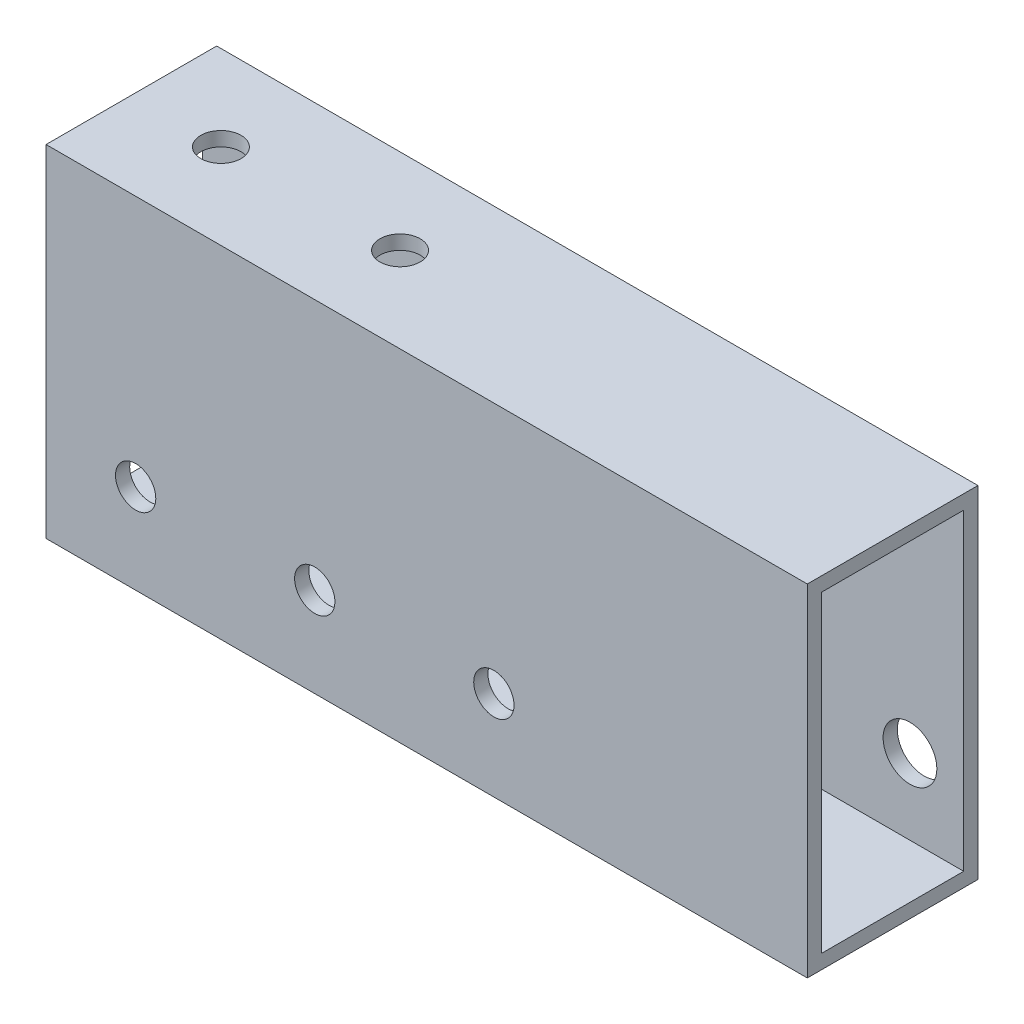
ISO-10303-21;
HEADER;
FILE_DESCRIPTION(('STEP AP214'),'2;1');
FILE_NAME('part.step','',(''),(''),'','','');
FILE_SCHEMA(('AUTOMOTIVE_DESIGN { 1 0 10303 214 1 1 1 1 }'));
ENDSEC;
DATA;
#1=APPLICATION_CONTEXT('core data for automotive mechanical design processes');
#2=APPLICATION_PROTOCOL_DEFINITION('international standard','automotive_design',2000,#1);
#3=PRODUCT_CONTEXT('',#1,'mechanical');
#4=PRODUCT('Part','Part','',(#3));
#5=PRODUCT_RELATED_PRODUCT_CATEGORY('part','',(#4));
#6=PRODUCT_DEFINITION_FORMATION('','',#4);
#7=PRODUCT_DEFINITION_CONTEXT('part definition',#1,'design');
#8=PRODUCT_DEFINITION('design','',#6,#7);
#9=PRODUCT_DEFINITION_SHAPE('','',#8);
#10=(LENGTH_UNIT() NAMED_UNIT(*) SI_UNIT(.MILLI.,.METRE.));
#11=(NAMED_UNIT(*) PLANE_ANGLE_UNIT() SI_UNIT($,.RADIAN.));
#12=(NAMED_UNIT(*) SI_UNIT($,.STERADIAN.) SOLID_ANGLE_UNIT());
#13=UNCERTAINTY_MEASURE_WITH_UNIT(LENGTH_MEASURE(1.E-05),#10,'distance_accuracy_value','');
#14=(GEOMETRIC_REPRESENTATION_CONTEXT(3) GLOBAL_UNCERTAINTY_ASSIGNED_CONTEXT((#13)) GLOBAL_UNIT_ASSIGNED_CONTEXT((#10,
#11,#12)) REPRESENTATION_CONTEXT('',''));
#15=CARTESIAN_POINT('',(0.,0.,0.));
#16=DIRECTION('',(0.,0.,1.));
#17=DIRECTION('',(1.,0.,0.));
#18=AXIS2_PLACEMENT_3D('',#15,#16,#17);
#19=CARTESIAN_POINT('',(-40.,38.1,-19.05));
#20=DIRECTION('',(0.,0.,-1.));
#21=DIRECTION('',(0.,1.,0.));
#22=AXIS2_PLACEMENT_3D('',#19,#20,#21);
#23=PLANE('',#22);
#24=CARTESIAN_POINT('',(118.,-18.1,-19.05));
#25=DIRECTION('',(0.,0.,-1.));
#26=DIRECTION('',(0.,1.,0.));
#27=AXIS2_PLACEMENT_3D('',#24,#25,#26);
#28=CIRCLE('',#27,6.00000000000001);
#29=CARTESIAN_POINT('',(118.,-12.1,-19.05));
#30=VERTEX_POINT('',#29);
#31=EDGE_CURVE('E307',#30,#30,#28,.T.);
#32=ORIENTED_EDGE('',*,*,#31,.F.);
#33=EDGE_LOOP('',(#32));
#34=FACE_BOUND('',#33,.T.);
#35=CARTESIAN_POINT('',(82.,-18.1,-19.05));
#36=DIRECTION('',(0.,0.,-1.));
#37=DIRECTION('',(0.,1.,0.));
#38=AXIS2_PLACEMENT_3D('',#35,#36,#37);
#39=CIRCLE('',#38,6.00000000000001);
#40=CARTESIAN_POINT('',(82.,-12.1,-19.05));
#41=VERTEX_POINT('',#40);
#42=EDGE_CURVE('E311',#41,#41,#39,.T.);
#43=ORIENTED_EDGE('',*,*,#42,.F.);
#44=EDGE_LOOP('',(#43));
#45=FACE_BOUND('',#44,.T.);
#46=CARTESIAN_POINT('',(-20.,-18.1,-19.05));
#47=DIRECTION('',(0.,0.,-1.));
#48=DIRECTION('',(0.,1.,0.));
#49=AXIS2_PLACEMENT_3D('',#46,#47,#48);
#50=CIRCLE('',#49,4.5);
#51=CARTESIAN_POINT('',(-20.,-13.6,-19.05));
#52=VERTEX_POINT('',#51);
#53=EDGE_CURVE('E237',#52,#52,#50,.T.);
#54=ORIENTED_EDGE('',*,*,#53,.F.);
#55=EDGE_LOOP('',(#54));
#56=FACE_BOUND('',#55,.T.);
#57=CARTESIAN_POINT('',(20.,-18.1,-19.05));
#58=DIRECTION('',(0.,0.,-1.));
#59=DIRECTION('',(0.,1.,0.));
#60=AXIS2_PLACEMENT_3D('',#57,#58,#59);
#61=CIRCLE('',#60,4.5);
#62=CARTESIAN_POINT('',(20.,-13.6,-19.05));
#63=VERTEX_POINT('',#62);
#64=EDGE_CURVE('E255',#63,#63,#61,.T.);
#65=ORIENTED_EDGE('',*,*,#64,.F.);
#66=EDGE_LOOP('',(#65));
#67=FACE_BOUND('',#66,.T.);
#68=CARTESIAN_POINT('',(60.,-18.1,-19.05));
#69=DIRECTION('',(0.,0.,-1.));
#70=DIRECTION('',(0.,1.,0.));
#71=AXIS2_PLACEMENT_3D('',#68,#69,#70);
#72=CIRCLE('',#71,4.5);
#73=CARTESIAN_POINT('',(60.,-13.6,-19.05));
#74=VERTEX_POINT('',#73);
#75=EDGE_CURVE('E267',#74,#74,#72,.T.);
#76=ORIENTED_EDGE('',*,*,#75,.F.);
#77=EDGE_LOOP('',(#76));
#78=FACE_BOUND('',#77,.T.);
#79=DIRECTION('',(1.,0.,0.));
#80=VECTOR('',#79,1.);
#81=CARTESIAN_POINT('',(-40.,38.1,-19.05));
#82=LINE('',#81,#80);
#83=CARTESIAN_POINT('',(-40.,38.1,-19.05));
#84=VERTEX_POINT('',#83);
#85=CARTESIAN_POINT('',(130.,38.1,-19.05));
#86=VERTEX_POINT('',#85);
#87=EDGE_CURVE('E217',#84,#86,#82,.T.);
#88=ORIENTED_EDGE('',*,*,#87,.T.);
#89=DIRECTION('',(0.,1.,0.));
#90=VECTOR('',#89,1.);
#91=CARTESIAN_POINT('',(130.,38.1,-19.05));
#92=LINE('',#91,#90);
#93=CARTESIAN_POINT('',(130.,-38.1,-19.05));
#94=VERTEX_POINT('',#93);
#95=EDGE_CURVE('E172',#94,#86,#92,.T.);
#96=ORIENTED_EDGE('',*,*,#95,.F.);
#97=DIRECTION('',(1.,0.,0.));
#98=VECTOR('',#97,1.);
#99=CARTESIAN_POINT('',(-40.,-38.1,-19.05));
#100=LINE('',#99,#98);
#101=CARTESIAN_POINT('',(-40.,-38.1,-19.05));
#102=VERTEX_POINT('',#101);
#103=EDGE_CURVE('E13',#102,#94,#100,.T.);
#104=ORIENTED_EDGE('',*,*,#103,.F.);
#105=DIRECTION('',(0.,1.,0.));
#106=VECTOR('',#105,1.);
#107=CARTESIAN_POINT('',(-40.,38.1,-19.05));
#108=LINE('',#107,#106);
#109=EDGE_CURVE('E204',#102,#84,#108,.T.);
#110=ORIENTED_EDGE('',*,*,#109,.T.);
#111=EDGE_LOOP('',(#88,#96,#104,#110));
#112=FACE_BOUND('',#111,.T.);
#113=ADVANCED_FACE('F86',(#34,#45,#56,#67,#78,#112),#23,.T.);
#114=CARTESIAN_POINT('',(-40.,-38.1,19.05));
#115=DIRECTION('',(0.,-1.,0.));
#116=DIRECTION('',(0.,0.,-1.));
#117=AXIS2_PLACEMENT_3D('',#114,#115,#116);
#118=PLANE('',#117);
#119=CARTESIAN_POINT('',(20.,-38.1,0.));
#120=DIRECTION('',(0.,-1.,0.));
#121=DIRECTION('',(0.,0.,-1.));
#122=AXIS2_PLACEMENT_3D('',#119,#120,#121);
#123=CIRCLE('',#122,4.49999999999999);
#124=CARTESIAN_POINT('',(20.,-38.1,-4.49999999999999));
#125=VERTEX_POINT('',#124);
#126=EDGE_CURVE('E521',#125,#125,#123,.T.);
#127=ORIENTED_EDGE('',*,*,#126,.F.);
#128=EDGE_LOOP('',(#127));
#129=FACE_BOUND('',#128,.T.);
#130=CARTESIAN_POINT('',(-20.,-38.1,0.));
#131=DIRECTION('',(0.,-1.,0.));
#132=DIRECTION('',(0.,0.,-1.));
#133=AXIS2_PLACEMENT_3D('',#130,#131,#132);
#134=CIRCLE('',#133,4.49999999999999);
#135=CARTESIAN_POINT('',(-20.,-38.1,-4.5));
#136=VERTEX_POINT('',#135);
#137=EDGE_CURVE('E240',#136,#136,#134,.T.);
#138=ORIENTED_EDGE('',*,*,#137,.F.);
#139=EDGE_LOOP('',(#138));
#140=FACE_BOUND('',#139,.T.);
#141=ORIENTED_EDGE('',*,*,#103,.T.);
#142=DIRECTION('',(0.,0.,-1.));
#143=VECTOR('',#142,1.);
#144=CARTESIAN_POINT('',(130.,-38.1,19.05));
#145=LINE('',#144,#143);
#146=CARTESIAN_POINT('',(130.,-38.1,19.05));
#147=VERTEX_POINT('',#146);
#148=EDGE_CURVE('E185',#147,#94,#145,.T.);
#149=ORIENTED_EDGE('',*,*,#148,.F.);
#150=DIRECTION('',(1.,0.,0.));
#151=VECTOR('',#150,1.);
#152=CARTESIAN_POINT('',(-40.,-38.1,19.05));
#153=LINE('',#152,#151);
#154=CARTESIAN_POINT('',(-40.,-38.1,19.05));
#155=VERTEX_POINT('',#154);
#156=EDGE_CURVE('E94',#155,#147,#153,.T.);
#157=ORIENTED_EDGE('',*,*,#156,.F.);
#158=DIRECTION('',(0.,0.,-1.));
#159=VECTOR('',#158,1.);
#160=CARTESIAN_POINT('',(-40.,-38.1,19.05));
#161=LINE('',#160,#159);
#162=EDGE_CURVE('E215',#155,#102,#161,.T.);
#163=ORIENTED_EDGE('',*,*,#162,.T.);
#164=EDGE_LOOP('',(#141,#149,#157,#163));
#165=FACE_BOUND('',#164,.T.);
#166=ADVANCED_FACE('F297',(#129,#140,#165),#118,.T.);
#167=CARTESIAN_POINT('',(-40.,38.1,19.05));
#168=DIRECTION('',(0.,0.,1.));
#169=DIRECTION('',(0.,-1.,0.));
#170=AXIS2_PLACEMENT_3D('',#167,#168,#169);
#171=PLANE('',#170);
#172=CARTESIAN_POINT('',(-20.,-18.1,19.05));
#173=DIRECTION('',(0.,0.,-1.));
#174=DIRECTION('',(0.,1.,0.));
#175=AXIS2_PLACEMENT_3D('',#172,#173,#174);
#176=CIRCLE('',#175,4.5);
#177=CARTESIAN_POINT('',(-20.,-13.6,19.05));
#178=VERTEX_POINT('',#177);
#179=EDGE_CURVE('E229',#178,#178,#176,.T.);
#180=ORIENTED_EDGE('',*,*,#179,.T.);
#181=EDGE_LOOP('',(#180));
#182=FACE_BOUND('',#181,.T.);
#183=CARTESIAN_POINT('',(20.,-18.1,19.05));
#184=DIRECTION('',(0.,0.,-1.));
#185=DIRECTION('',(0.,1.,0.));
#186=AXIS2_PLACEMENT_3D('',#183,#184,#185);
#187=CIRCLE('',#186,4.5);
#188=CARTESIAN_POINT('',(20.,-13.6,19.05));
#189=VERTEX_POINT('',#188);
#190=EDGE_CURVE('E258',#189,#189,#187,.T.);
#191=ORIENTED_EDGE('',*,*,#190,.T.);
#192=EDGE_LOOP('',(#191));
#193=FACE_BOUND('',#192,.T.);
#194=CARTESIAN_POINT('',(60.,-18.1,19.05));
#195=DIRECTION('',(0.,0.,-1.));
#196=DIRECTION('',(0.,1.,0.));
#197=AXIS2_PLACEMENT_3D('',#194,#195,#196);
#198=CIRCLE('',#197,4.49999999999999);
#199=CARTESIAN_POINT('',(60.,-13.6,19.05));
#200=VERTEX_POINT('',#199);
#201=EDGE_CURVE('E225',#200,#200,#198,.T.);
#202=ORIENTED_EDGE('',*,*,#201,.T.);
#203=EDGE_LOOP('',(#202));
#204=FACE_BOUND('',#203,.T.);
#205=ORIENTED_EDGE('',*,*,#156,.T.);
#206=DIRECTION('',(0.,-1.,0.));
#207=VECTOR('',#206,1.);
#208=CARTESIAN_POINT('',(130.,38.1,19.05));
#209=LINE('',#208,#207);
#210=CARTESIAN_POINT('',(130.,38.1,19.05));
#211=VERTEX_POINT('',#210);
#212=EDGE_CURVE('E188',#211,#147,#209,.T.);
#213=ORIENTED_EDGE('',*,*,#212,.F.);
#214=DIRECTION('',(1.,0.,0.));
#215=VECTOR('',#214,1.);
#216=CARTESIAN_POINT('',(-40.,38.1,19.05));
#217=LINE('',#216,#215);
#218=CARTESIAN_POINT('',(-40.,38.1,19.05));
#219=VERTEX_POINT('',#218);
#220=EDGE_CURVE('E220',#219,#211,#217,.T.);
#221=ORIENTED_EDGE('',*,*,#220,.F.);
#222=DIRECTION('',(0.,-1.,0.));
#223=VECTOR('',#222,1.);
#224=CARTESIAN_POINT('',(-40.,38.1,19.05));
#225=LINE('',#224,#223);
#226=EDGE_CURVE('E212',#219,#155,#225,.T.);
#227=ORIENTED_EDGE('',*,*,#226,.T.);
#228=EDGE_LOOP('',(#205,#213,#221,#227));
#229=FACE_BOUND('',#228,.T.);
#230=ADVANCED_FACE('F272',(#182,#193,#204,#229),#171,.T.);
#231=CARTESIAN_POINT('',(-40.,38.1,19.05));
#232=DIRECTION('',(0.,1.,0.));
#233=DIRECTION('',(0.,0.,1.));
#234=AXIS2_PLACEMENT_3D('',#231,#232,#233);
#235=PLANE('',#234);
#236=CARTESIAN_POINT('',(20.,38.1,0.));
#237=DIRECTION('',(0.,-1.,0.));
#238=DIRECTION('',(0.,0.,-1.));
#239=AXIS2_PLACEMENT_3D('',#236,#237,#238);
#240=CIRCLE('',#239,4.49999999999999);
#241=CARTESIAN_POINT('',(20.,38.1,-4.49999999999999));
#242=VERTEX_POINT('',#241);
#243=EDGE_CURVE('E524',#242,#242,#240,.T.);
#244=ORIENTED_EDGE('',*,*,#243,.T.);
#245=EDGE_LOOP('',(#244));
#246=FACE_BOUND('',#245,.T.);
#247=CARTESIAN_POINT('',(-20.,38.1,0.));
#248=DIRECTION('',(0.,-1.,0.));
#249=DIRECTION('',(0.,0.,-1.));
#250=AXIS2_PLACEMENT_3D('',#247,#248,#249);
#251=CIRCLE('',#250,4.49999999999999);
#252=CARTESIAN_POINT('',(-20.,38.1,-4.49999999999999));
#253=VERTEX_POINT('',#252);
#254=EDGE_CURVE('E233',#253,#253,#251,.T.);
#255=ORIENTED_EDGE('',*,*,#254,.T.);
#256=EDGE_LOOP('',(#255));
#257=FACE_BOUND('',#256,.T.);
#258=ORIENTED_EDGE('',*,*,#220,.T.);
#259=DIRECTION('',(0.,0.,1.));
#260=VECTOR('',#259,1.);
#261=CARTESIAN_POINT('',(130.,38.1,19.05));
#262=LINE('',#261,#260);
#263=EDGE_CURVE('E191',#86,#211,#262,.T.);
#264=ORIENTED_EDGE('',*,*,#263,.F.);
#265=ORIENTED_EDGE('',*,*,#87,.F.);
#266=DIRECTION('',(0.,0.,1.));
#267=VECTOR('',#266,1.);
#268=CARTESIAN_POINT('',(-40.,38.1,19.05));
#269=LINE('',#268,#267);
#270=EDGE_CURVE('E209',#84,#219,#269,.T.);
#271=ORIENTED_EDGE('',*,*,#270,.T.);
#272=EDGE_LOOP('',(#258,#264,#265,#271));
#273=FACE_BOUND('',#272,.T.);
#274=ADVANCED_FACE('F320',(#246,#257,#273),#235,.T.);
#275=CARTESIAN_POINT('',(-40.,0.,0.));
#276=DIRECTION('',(1.,0.,0.));
#277=DIRECTION('',(0.,0.,-1.));
#278=AXIS2_PLACEMENT_3D('',#275,#276,#277);
#279=PLANE('',#278);
#280=DIRECTION('',(0.,0.,-1.));
#281=VECTOR('',#280,1.);
#282=CARTESIAN_POINT('',(-40.,-34.925,19.05));
#283=LINE('',#282,#281);
#284=CARTESIAN_POINT('',(-40.,-34.925,15.875));
#285=VERTEX_POINT('',#284);
#286=CARTESIAN_POINT('',(-40.,-34.925,-15.875));
#287=VERTEX_POINT('',#286);
#288=EDGE_CURVE('E156',#285,#287,#283,.T.);
#289=ORIENTED_EDGE('',*,*,#288,.T.);
#290=DIRECTION('',(0.,1.,0.));
#291=VECTOR('',#290,1.);
#292=CARTESIAN_POINT('',(-40.,38.1,-15.875));
#293=LINE('',#292,#291);
#294=CARTESIAN_POINT('',(-40.,34.925,-15.875));
#295=VERTEX_POINT('',#294);
#296=EDGE_CURVE('E171',#287,#295,#293,.T.);
#297=ORIENTED_EDGE('',*,*,#296,.T.);
#298=DIRECTION('',(0.,0.,1.));
#299=VECTOR('',#298,1.);
#300=CARTESIAN_POINT('',(-40.,34.925,19.05));
#301=LINE('',#300,#299);
#302=CARTESIAN_POINT('',(-40.,34.925,15.875));
#303=VERTEX_POINT('',#302);
#304=EDGE_CURVE('E198',#295,#303,#301,.T.);
#305=ORIENTED_EDGE('',*,*,#304,.T.);
#306=DIRECTION('',(0.,-1.,0.));
#307=VECTOR('',#306,1.);
#308=CARTESIAN_POINT('',(-40.,38.1,15.875));
#309=LINE('',#308,#307);
#310=EDGE_CURVE('E102',#303,#285,#309,.T.);
#311=ORIENTED_EDGE('',*,*,#310,.T.);
#312=EDGE_LOOP('',(#289,#297,#305,#311));
#313=FACE_BOUND('',#312,.T.);
#314=ORIENTED_EDGE('',*,*,#109,.F.);
#315=ORIENTED_EDGE('',*,*,#162,.F.);
#316=ORIENTED_EDGE('',*,*,#226,.F.);
#317=ORIENTED_EDGE('',*,*,#270,.F.);
#318=EDGE_LOOP('',(#314,#315,#316,#317));
#319=FACE_BOUND('',#318,.T.);
#320=ADVANCED_FACE('F327',(#313,#319),#279,.F.);
#321=CARTESIAN_POINT('',(-40.,38.1,-15.875));
#322=DIRECTION('',(0.,0.,-1.));
#323=DIRECTION('',(0.,1.,0.));
#324=AXIS2_PLACEMENT_3D('',#321,#322,#323);
#325=PLANE('',#324);
#326=CARTESIAN_POINT('',(118.,-18.1,-15.875));
#327=DIRECTION('',(0.,0.,-1.));
#328=DIRECTION('',(0.,1.,0.));
#329=AXIS2_PLACEMENT_3D('',#326,#327,#328);
#330=CIRCLE('',#329,6.00000000000001);
#331=CARTESIAN_POINT('',(118.,-12.1,-15.875));
#332=VERTEX_POINT('',#331);
#333=EDGE_CURVE('E347',#332,#332,#330,.T.);
#334=ORIENTED_EDGE('',*,*,#333,.T.);
#335=EDGE_LOOP('',(#334));
#336=FACE_BOUND('',#335,.T.);
#337=CARTESIAN_POINT('',(82.,-18.1,-15.875));
#338=DIRECTION('',(0.,0.,-1.));
#339=DIRECTION('',(0.,1.,0.));
#340=AXIS2_PLACEMENT_3D('',#337,#338,#339);
#341=CIRCLE('',#340,6.00000000000001);
#342=CARTESIAN_POINT('',(82.,-12.1,-15.875));
#343=VERTEX_POINT('',#342);
#344=EDGE_CURVE('E351',#343,#343,#341,.T.);
#345=ORIENTED_EDGE('',*,*,#344,.T.);
#346=EDGE_LOOP('',(#345));
#347=FACE_BOUND('',#346,.T.);
#348=CARTESIAN_POINT('',(-20.,-18.1,-15.875));
#349=DIRECTION('',(0.,0.,-1.));
#350=DIRECTION('',(0.,1.,0.));
#351=AXIS2_PLACEMENT_3D('',#348,#349,#350);
#352=CIRCLE('',#351,4.5);
#353=CARTESIAN_POINT('',(-20.,-13.6,-15.875));
#354=VERTEX_POINT('',#353);
#355=EDGE_CURVE('E228',#354,#354,#352,.T.);
#356=ORIENTED_EDGE('',*,*,#355,.T.);
#357=EDGE_LOOP('',(#356));
#358=FACE_BOUND('',#357,.T.);
#359=CARTESIAN_POINT('',(20.,-18.1,-15.875));
#360=DIRECTION('',(0.,0.,-1.));
#361=DIRECTION('',(0.,1.,0.));
#362=AXIS2_PLACEMENT_3D('',#359,#360,#361);
#363=CIRCLE('',#362,4.5);
#364=CARTESIAN_POINT('',(20.,-13.6,-15.875));
#365=VERTEX_POINT('',#364);
#366=EDGE_CURVE('E264',#365,#365,#363,.T.);
#367=ORIENTED_EDGE('',*,*,#366,.T.);
#368=EDGE_LOOP('',(#367));
#369=FACE_BOUND('',#368,.T.);
#370=CARTESIAN_POINT('',(60.,-18.1,-15.875));
#371=DIRECTION('',(0.,0.,-1.));
#372=DIRECTION('',(0.,1.,0.));
#373=AXIS2_PLACEMENT_3D('',#370,#371,#372);
#374=CIRCLE('',#373,4.5);
#375=CARTESIAN_POINT('',(60.,-13.6,-15.875));
#376=VERTEX_POINT('',#375);
#377=EDGE_CURVE('E176',#376,#376,#374,.T.);
#378=ORIENTED_EDGE('',*,*,#377,.T.);
#379=EDGE_LOOP('',(#378));
#380=FACE_BOUND('',#379,.T.);
#381=DIRECTION('',(1.,0.,0.));
#382=VECTOR('',#381,1.);
#383=CARTESIAN_POINT('',(-40.,-34.925,-15.875));
#384=LINE('',#383,#382);
#385=CARTESIAN_POINT('',(130.,-34.925,-15.875));
#386=VERTEX_POINT('',#385);
#387=EDGE_CURVE('E158',#287,#386,#384,.T.);
#388=ORIENTED_EDGE('',*,*,#387,.T.);
#389=DIRECTION('',(0.,1.,0.));
#390=VECTOR('',#389,1.);
#391=CARTESIAN_POINT('',(130.,38.1,-15.875));
#392=LINE('',#391,#390);
#393=CARTESIAN_POINT('',(130.,34.925,-15.875));
#394=VERTEX_POINT('',#393);
#395=EDGE_CURVE('E170',#386,#394,#392,.T.);
#396=ORIENTED_EDGE('',*,*,#395,.T.);
#397=DIRECTION('',(1.,0.,0.));
#398=VECTOR('',#397,1.);
#399=CARTESIAN_POINT('',(-40.,34.925,-15.875));
#400=LINE('',#399,#398);
#401=EDGE_CURVE('E203',#295,#394,#400,.T.);
#402=ORIENTED_EDGE('',*,*,#401,.F.);
#403=ORIENTED_EDGE('',*,*,#296,.F.);
#404=EDGE_LOOP('',(#388,#396,#402,#403));
#405=FACE_BOUND('',#404,.T.);
#406=ADVANCED_FACE('F292',(#336,#347,#358,#369,#380,#405),#325,.F.);
#407=CARTESIAN_POINT('',(-40.,-34.925,19.05));
#408=DIRECTION('',(0.,-1.,0.));
#409=DIRECTION('',(0.,0.,-1.));
#410=AXIS2_PLACEMENT_3D('',#407,#408,#409);
#411=PLANE('',#410);
#412=CARTESIAN_POINT('',(20.,-34.925,0.));
#413=DIRECTION('',(0.,-1.,0.));
#414=DIRECTION('',(0.,0.,-1.));
#415=AXIS2_PLACEMENT_3D('',#412,#413,#414);
#416=CIRCLE('',#415,4.49999999999999);
#417=CARTESIAN_POINT('',(20.,-34.925,-4.49999999999999));
#418=VERTEX_POINT('',#417);
#419=EDGE_CURVE('E245',#418,#418,#416,.T.);
#420=ORIENTED_EDGE('',*,*,#419,.T.);
#421=EDGE_LOOP('',(#420));
#422=FACE_BOUND('',#421,.T.);
#423=CARTESIAN_POINT('',(-20.,-34.925,0.));
#424=DIRECTION('',(0.,-1.,0.));
#425=DIRECTION('',(0.,0.,-1.));
#426=AXIS2_PLACEMENT_3D('',#423,#424,#425);
#427=CIRCLE('',#426,4.49999999999999);
#428=CARTESIAN_POINT('',(-20.,-34.925,-4.49999999999999));
#429=VERTEX_POINT('',#428);
#430=EDGE_CURVE('E232',#429,#429,#427,.T.);
#431=ORIENTED_EDGE('',*,*,#430,.T.);
#432=EDGE_LOOP('',(#431));
#433=FACE_BOUND('',#432,.T.);
#434=DIRECTION('',(1.,0.,0.));
#435=VECTOR('',#434,1.);
#436=CARTESIAN_POINT('',(-40.,-34.925,15.875));
#437=LINE('',#436,#435);
#438=CARTESIAN_POINT('',(130.,-34.925,15.875));
#439=VERTEX_POINT('',#438);
#440=EDGE_CURVE('E151',#285,#439,#437,.T.);
#441=ORIENTED_EDGE('',*,*,#440,.T.);
#442=DIRECTION('',(0.,0.,-1.));
#443=VECTOR('',#442,1.);
#444=CARTESIAN_POINT('',(130.,-34.925,19.05));
#445=LINE('',#444,#443);
#446=EDGE_CURVE('E154',#439,#386,#445,.T.);
#447=ORIENTED_EDGE('',*,*,#446,.T.);
#448=ORIENTED_EDGE('',*,*,#387,.F.);
#449=ORIENTED_EDGE('',*,*,#288,.F.);
#450=EDGE_LOOP('',(#441,#447,#448,#449));
#451=FACE_BOUND('',#450,.T.);
#452=ADVANCED_FACE('F153',(#422,#433,#451),#411,.F.);
#453=CARTESIAN_POINT('',(-40.,38.1,15.875));
#454=DIRECTION('',(0.,0.,1.));
#455=DIRECTION('',(0.,-1.,0.));
#456=AXIS2_PLACEMENT_3D('',#453,#454,#455);
#457=PLANE('',#456);
#458=CARTESIAN_POINT('',(-20.,-18.1,15.875));
#459=DIRECTION('',(0.,0.,1.));
#460=DIRECTION('',(0.,-1.,0.));
#461=AXIS2_PLACEMENT_3D('',#458,#459,#460);
#462=CIRCLE('',#461,4.5);
#463=CARTESIAN_POINT('',(-20.,-22.6,15.875));
#464=VERTEX_POINT('',#463);
#465=EDGE_CURVE('E226',#464,#464,#462,.T.);
#466=ORIENTED_EDGE('',*,*,#465,.T.);
#467=EDGE_LOOP('',(#466));
#468=FACE_BOUND('',#467,.T.);
#469=CARTESIAN_POINT('',(20.,-18.1,15.875));
#470=DIRECTION('',(0.,0.,1.));
#471=DIRECTION('',(0.,-1.,0.));
#472=AXIS2_PLACEMENT_3D('',#469,#470,#471);
#473=CIRCLE('',#472,4.5);
#474=CARTESIAN_POINT('',(20.,-22.6,15.875));
#475=VERTEX_POINT('',#474);
#476=EDGE_CURVE('E261',#475,#475,#473,.T.);
#477=ORIENTED_EDGE('',*,*,#476,.T.);
#478=EDGE_LOOP('',(#477));
#479=FACE_BOUND('',#478,.T.);
#480=CARTESIAN_POINT('',(60.,-18.1,15.875));
#481=DIRECTION('',(0.,0.,1.));
#482=DIRECTION('',(0.,-1.,0.));
#483=AXIS2_PLACEMENT_3D('',#480,#481,#482);
#484=CIRCLE('',#483,4.5);
#485=CARTESIAN_POINT('',(60.,-22.6,15.875));
#486=VERTEX_POINT('',#485);
#487=EDGE_CURVE('E180',#486,#486,#484,.T.);
#488=ORIENTED_EDGE('',*,*,#487,.T.);
#489=EDGE_LOOP('',(#488));
#490=FACE_BOUND('',#489,.T.);
#491=DIRECTION('',(1.,0.,0.));
#492=VECTOR('',#491,1.);
#493=CARTESIAN_POINT('',(-40.,34.925,15.875));
#494=LINE('',#493,#492);
#495=CARTESIAN_POINT('',(130.,34.925,15.875));
#496=VERTEX_POINT('',#495);
#497=EDGE_CURVE('E159',#303,#496,#494,.T.);
#498=ORIENTED_EDGE('',*,*,#497,.T.);
#499=DIRECTION('',(0.,-1.,0.));
#500=VECTOR('',#499,1.);
#501=CARTESIAN_POINT('',(130.,38.1,15.875));
#502=LINE('',#501,#500);
#503=EDGE_CURVE('E167',#496,#439,#502,.T.);
#504=ORIENTED_EDGE('',*,*,#503,.T.);
#505=ORIENTED_EDGE('',*,*,#440,.F.);
#506=ORIENTED_EDGE('',*,*,#310,.F.);
#507=EDGE_LOOP('',(#498,#504,#505,#506));
#508=FACE_BOUND('',#507,.T.);
#509=ADVANCED_FACE('F174',(#468,#479,#490,#508),#457,.F.);
#510=CARTESIAN_POINT('',(-40.,34.925,19.05));
#511=DIRECTION('',(0.,1.,0.));
#512=DIRECTION('',(0.,0.,1.));
#513=AXIS2_PLACEMENT_3D('',#510,#511,#512);
#514=PLANE('',#513);
#515=CARTESIAN_POINT('',(20.,34.925,0.));
#516=DIRECTION('',(0.,1.,0.));
#517=DIRECTION('',(0.,0.,1.));
#518=AXIS2_PLACEMENT_3D('',#515,#516,#517);
#519=CIRCLE('',#518,4.49999999999999);
#520=CARTESIAN_POINT('',(20.,34.925,4.49999999999999));
#521=VERTEX_POINT('',#520);
#522=EDGE_CURVE('E89',#521,#521,#519,.T.);
#523=ORIENTED_EDGE('',*,*,#522,.T.);
#524=EDGE_LOOP('',(#523));
#525=FACE_BOUND('',#524,.T.);
#526=CARTESIAN_POINT('',(-20.,34.925,0.));
#527=DIRECTION('',(0.,1.,0.));
#528=DIRECTION('',(0.,0.,1.));
#529=AXIS2_PLACEMENT_3D('',#526,#527,#528);
#530=CIRCLE('',#529,4.49999999999999);
#531=CARTESIAN_POINT('',(-20.,34.925,4.49999999999998));
#532=VERTEX_POINT('',#531);
#533=EDGE_CURVE('E230',#532,#532,#530,.T.);
#534=ORIENTED_EDGE('',*,*,#533,.T.);
#535=EDGE_LOOP('',(#534));
#536=FACE_BOUND('',#535,.T.);
#537=ORIENTED_EDGE('',*,*,#401,.T.);
#538=DIRECTION('',(0.,0.,1.));
#539=VECTOR('',#538,1.);
#540=CARTESIAN_POINT('',(130.,34.925,19.05));
#541=LINE('',#540,#539);
#542=EDGE_CURVE('E175',#394,#496,#541,.T.);
#543=ORIENTED_EDGE('',*,*,#542,.T.);
#544=ORIENTED_EDGE('',*,*,#497,.F.);
#545=ORIENTED_EDGE('',*,*,#304,.F.);
#546=EDGE_LOOP('',(#537,#543,#544,#545));
#547=FACE_BOUND('',#546,.T.);
#548=ADVANCED_FACE('F283',(#525,#536,#547),#514,.F.);
#549=CARTESIAN_POINT('',(130.,0.,0.));
#550=DIRECTION('',(1.,0.,0.));
#551=DIRECTION('',(0.,0.,-1.));
#552=AXIS2_PLACEMENT_3D('',#549,#550,#551);
#553=PLANE('',#552);
#554=ORIENTED_EDGE('',*,*,#395,.F.);
#555=ORIENTED_EDGE('',*,*,#446,.F.);
#556=ORIENTED_EDGE('',*,*,#503,.F.);
#557=ORIENTED_EDGE('',*,*,#542,.F.);
#558=EDGE_LOOP('',(#554,#555,#556,#557));
#559=FACE_BOUND('',#558,.T.);
#560=ORIENTED_EDGE('',*,*,#148,.T.);
#561=ORIENTED_EDGE('',*,*,#95,.T.);
#562=ORIENTED_EDGE('',*,*,#263,.T.);
#563=ORIENTED_EDGE('',*,*,#212,.T.);
#564=EDGE_LOOP('',(#560,#561,#562,#563));
#565=FACE_BOUND('',#564,.T.);
#566=ADVANCED_FACE('F164',(#559,#565),#553,.T.);
#567=CARTESIAN_POINT('',(60.,-18.1,-19.05));
#568=DIRECTION('',(0.,0.,-1.));
#569=DIRECTION('',(0.,1.,0.));
#570=AXIS2_PLACEMENT_3D('',#567,#568,#569);
#571=CYLINDRICAL_SURFACE('',#570,4.5);
#572=ORIENTED_EDGE('',*,*,#201,.F.);
#573=EDGE_LOOP('',(#572));
#574=FACE_BOUND('',#573,.T.);
#575=ORIENTED_EDGE('',*,*,#487,.F.);
#576=EDGE_LOOP('',(#575));
#577=FACE_BOUND('',#576,.T.);
#578=ADVANCED_FACE('F275',(#574,#577),#571,.F.);
#579=ORIENTED_EDGE('',*,*,#75,.T.);
#580=EDGE_LOOP('',(#579));
#581=FACE_BOUND('',#580,.T.);
#582=ORIENTED_EDGE('',*,*,#377,.F.);
#583=EDGE_LOOP('',(#582));
#584=FACE_BOUND('',#583,.T.);
#585=ADVANCED_FACE('F278',(#581,#584),#571,.F.);
#586=CARTESIAN_POINT('',(20.,-18.1,-19.05));
#587=DIRECTION('',(0.,0.,-1.));
#588=DIRECTION('',(0.,1.,0.));
#589=AXIS2_PLACEMENT_3D('',#586,#587,#588);
#590=CYLINDRICAL_SURFACE('',#589,4.5);
#591=ORIENTED_EDGE('',*,*,#190,.F.);
#592=EDGE_LOOP('',(#591));
#593=FACE_BOUND('',#592,.T.);
#594=ORIENTED_EDGE('',*,*,#476,.F.);
#595=EDGE_LOOP('',(#594));
#596=FACE_BOUND('',#595,.T.);
#597=ADVANCED_FACE('F363',(#593,#596),#590,.F.);
#598=ORIENTED_EDGE('',*,*,#64,.T.);
#599=EDGE_LOOP('',(#598));
#600=FACE_BOUND('',#599,.T.);
#601=ORIENTED_EDGE('',*,*,#366,.F.);
#602=EDGE_LOOP('',(#601));
#603=FACE_BOUND('',#602,.T.);
#604=ADVANCED_FACE('F368',(#600,#603),#590,.F.);
#605=CARTESIAN_POINT('',(-20.,-18.1,-19.05));
#606=DIRECTION('',(0.,0.,-1.));
#607=DIRECTION('',(0.,1.,0.));
#608=AXIS2_PLACEMENT_3D('',#605,#606,#607);
#609=CYLINDRICAL_SURFACE('',#608,4.5);
#610=ORIENTED_EDGE('',*,*,#179,.F.);
#611=EDGE_LOOP('',(#610));
#612=FACE_BOUND('',#611,.T.);
#613=ORIENTED_EDGE('',*,*,#465,.F.);
#614=EDGE_LOOP('',(#613));
#615=FACE_BOUND('',#614,.T.);
#616=ADVANCED_FACE('F404',(#612,#615),#609,.F.);
#617=ORIENTED_EDGE('',*,*,#53,.T.);
#618=EDGE_LOOP('',(#617));
#619=FACE_BOUND('',#618,.T.);
#620=ORIENTED_EDGE('',*,*,#355,.F.);
#621=EDGE_LOOP('',(#620));
#622=FACE_BOUND('',#621,.T.);
#623=ADVANCED_FACE('F413',(#619,#622),#609,.F.);
#624=CARTESIAN_POINT('',(-20.,-38.1,0.));
#625=DIRECTION('',(0.,-1.,0.));
#626=DIRECTION('',(0.,0.,-1.));
#627=AXIS2_PLACEMENT_3D('',#624,#625,#626);
#628=CYLINDRICAL_SURFACE('',#627,4.49999999999999);
#629=ORIENTED_EDGE('',*,*,#254,.F.);
#630=EDGE_LOOP('',(#629));
#631=FACE_BOUND('',#630,.T.);
#632=ORIENTED_EDGE('',*,*,#533,.F.);
#633=EDGE_LOOP('',(#632));
#634=FACE_BOUND('',#633,.T.);
#635=ADVANCED_FACE('F422',(#631,#634),#628,.F.);
#636=ORIENTED_EDGE('',*,*,#137,.T.);
#637=EDGE_LOOP('',(#636));
#638=FACE_BOUND('',#637,.T.);
#639=ORIENTED_EDGE('',*,*,#430,.F.);
#640=EDGE_LOOP('',(#639));
#641=FACE_BOUND('',#640,.T.);
#642=ADVANCED_FACE('F457',(#638,#641),#628,.F.);
#643=CARTESIAN_POINT('',(20.,-38.1,0.));
#644=DIRECTION('',(0.,-1.,0.));
#645=DIRECTION('',(0.,0.,-1.));
#646=AXIS2_PLACEMENT_3D('',#643,#644,#645);
#647=CYLINDRICAL_SURFACE('',#646,4.49999999999999);
#648=ORIENTED_EDGE('',*,*,#243,.F.);
#649=EDGE_LOOP('',(#648));
#650=FACE_BOUND('',#649,.T.);
#651=ORIENTED_EDGE('',*,*,#522,.F.);
#652=EDGE_LOOP('',(#651));
#653=FACE_BOUND('',#652,.T.);
#654=ADVANCED_FACE('F467',(#650,#653),#647,.F.);
#655=ORIENTED_EDGE('',*,*,#126,.T.);
#656=EDGE_LOOP('',(#655));
#657=FACE_BOUND('',#656,.T.);
#658=ORIENTED_EDGE('',*,*,#419,.F.);
#659=EDGE_LOOP('',(#658));
#660=FACE_BOUND('',#659,.T.);
#661=ADVANCED_FACE('F476',(#657,#660),#647,.F.);
#662=CARTESIAN_POINT('',(82.,-18.1,-19.05));
#663=DIRECTION('',(0.,0.,-1.));
#664=DIRECTION('',(0.,1.,0.));
#665=AXIS2_PLACEMENT_3D('',#662,#663,#664);
#666=CYLINDRICAL_SURFACE('',#665,6.00000000000001);
#667=ORIENTED_EDGE('',*,*,#344,.F.);
#668=EDGE_LOOP('',(#667));
#669=FACE_BOUND('',#668,.T.);
#670=ORIENTED_EDGE('',*,*,#42,.T.);
#671=EDGE_LOOP('',(#670));
#672=FACE_BOUND('',#671,.T.);
#673=ADVANCED_FACE('F485',(#669,#672),#666,.F.);
#674=CARTESIAN_POINT('',(118.,-18.1,-19.05));
#675=DIRECTION('',(0.,0.,-1.));
#676=DIRECTION('',(0.,1.,0.));
#677=AXIS2_PLACEMENT_3D('',#674,#675,#676);
#678=CYLINDRICAL_SURFACE('',#677,6.00000000000001);
#679=ORIENTED_EDGE('',*,*,#333,.F.);
#680=EDGE_LOOP('',(#679));
#681=FACE_BOUND('',#680,.T.);
#682=ORIENTED_EDGE('',*,*,#31,.T.);
#683=EDGE_LOOP('',(#682));
#684=FACE_BOUND('',#683,.T.);
#685=ADVANCED_FACE('F501',(#681,#684),#678,.F.);
#686=CLOSED_SHELL('',(#113,#166,#230,#274,#320,#406,#452,#509,#548,#566,#578,#585,#597,#604,
#616,#623,#635,#642,#654,#661,#673,#685));
#687=MANIFOLD_SOLID_BREP('B2',#686);
#688=ADVANCED_BREP_SHAPE_REPRESENTATION('',(#18,#687),#14);
#689=SHAPE_DEFINITION_REPRESENTATION(#9,#688);
ENDSEC;
END-ISO-10303-21;
